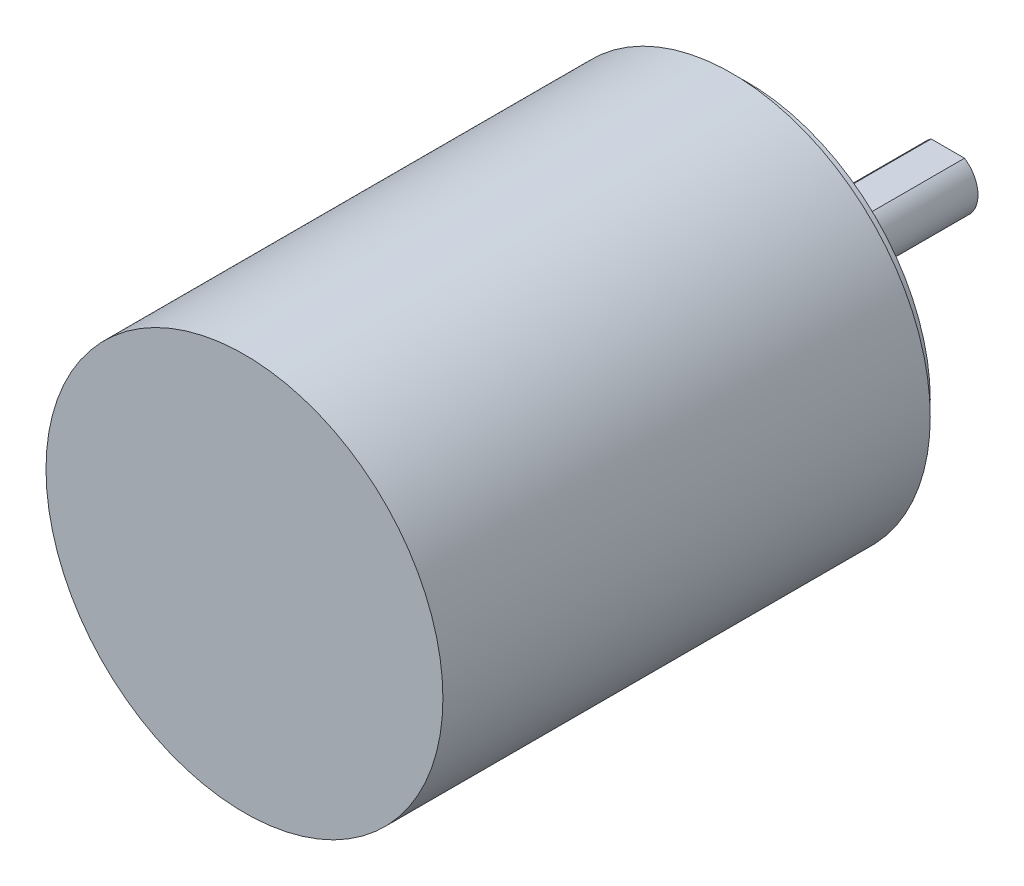
ISO-10303-21;
HEADER;
FILE_DESCRIPTION(('STEP AP214'),'2;1');
FILE_NAME('part.step','',(''),(''),'','','');
FILE_SCHEMA(('AUTOMOTIVE_DESIGN { 1 0 10303 214 1 1 1 1 }'));
ENDSEC;
DATA;
#1=APPLICATION_CONTEXT('core data for automotive mechanical design processes');
#2=APPLICATION_PROTOCOL_DEFINITION('international standard','automotive_design',2000,#1);
#3=PRODUCT_CONTEXT('',#1,'mechanical');
#4=PRODUCT('Part','Part','',(#3));
#5=PRODUCT_RELATED_PRODUCT_CATEGORY('part','',(#4));
#6=PRODUCT_DEFINITION_FORMATION('','',#4);
#7=PRODUCT_DEFINITION_CONTEXT('part definition',#1,'design');
#8=PRODUCT_DEFINITION('design','',#6,#7);
#9=PRODUCT_DEFINITION_SHAPE('','',#8);
#10=(LENGTH_UNIT() NAMED_UNIT(*) SI_UNIT(.MILLI.,.METRE.));
#11=(NAMED_UNIT(*) PLANE_ANGLE_UNIT() SI_UNIT($,.RADIAN.));
#12=(NAMED_UNIT(*) SI_UNIT($,.STERADIAN.) SOLID_ANGLE_UNIT());
#13=UNCERTAINTY_MEASURE_WITH_UNIT(LENGTH_MEASURE(1.E-05),#10,'distance_accuracy_value','');
#14=(GEOMETRIC_REPRESENTATION_CONTEXT(3) GLOBAL_UNCERTAINTY_ASSIGNED_CONTEXT((#13)) GLOBAL_UNIT_ASSIGNED_CONTEXT((#10,
#11,#12)) REPRESENTATION_CONTEXT('',''));
#15=CARTESIAN_POINT('',(0.,0.,0.));
#16=DIRECTION('',(0.,0.,1.));
#17=DIRECTION('',(1.,0.,0.));
#18=AXIS2_PLACEMENT_3D('',#15,#16,#17);
#19=CARTESIAN_POINT('',(0.,0.,-40.));
#20=DIRECTION('',(0.,0.,1.));
#21=DIRECTION('',(1.,0.,0.));
#22=AXIS2_PLACEMENT_3D('',#19,#20,#21);
#23=PLANE('',#22);
#24=CARTESIAN_POINT('',(0.,0.,-40.));
#25=DIRECTION('',(0.,0.,1.));
#26=DIRECTION('',(1.,0.,0.));
#27=AXIS2_PLACEMENT_3D('',#24,#25,#26);
#28=CIRCLE('',#27,6.);
#29=CARTESIAN_POINT('',(-3.3166247903554,5.,-40.));
#30=VERTEX_POINT('',#29);
#31=CARTESIAN_POINT('',(3.3166247903554,5.,-40.));
#32=VERTEX_POINT('',#31);
#33=EDGE_CURVE('E69',#30,#32,#28,.T.);
#34=ORIENTED_EDGE('',*,*,#33,.F.);
#35=DIRECTION('',(1.,0.,0.));
#36=VECTOR('',#35,1.);
#37=CARTESIAN_POINT('',(-8.,5.,-40.));
#38=LINE('',#37,#36);
#39=EDGE_CURVE('E72',#30,#32,#38,.T.);
#40=ORIENTED_EDGE('',*,*,#39,.T.);
#41=EDGE_LOOP('',(#34,#40));
#42=FACE_BOUND('',#41,.T.);
#43=ADVANCED_FACE('F41',(#42),#23,.F.);
#44=CARTESIAN_POINT('',(0.,0.,105.));
#45=DIRECTION('',(0.,0.,1.));
#46=DIRECTION('',(1.,0.,0.));
#47=AXIS2_PLACEMENT_3D('',#44,#45,#46);
#48=CYLINDRICAL_SURFACE('',#47,6.);
#49=ORIENTED_EDGE('',*,*,#33,.T.);
#50=DIRECTION('',(0.,0.,1.));
#51=VECTOR('',#50,1.);
#52=CARTESIAN_POINT('',(3.3166247903554,5.,105.));
#53=LINE('',#52,#51);
#54=CARTESIAN_POINT('',(3.3166247903554,5.,-11.));
#55=VERTEX_POINT('',#54);
#56=EDGE_CURVE('E11',#32,#55,#53,.T.);
#57=ORIENTED_EDGE('',*,*,#56,.T.);
#58=CARTESIAN_POINT('',(0.,0.,-11.));
#59=DIRECTION('',(0.,0.,-1.));
#60=DIRECTION('',(-1.,0.,0.));
#61=AXIS2_PLACEMENT_3D('',#58,#59,#60);
#62=CIRCLE('',#61,6.);
#63=CARTESIAN_POINT('',(-3.3166247903554,5.,-11.));
#64=VERTEX_POINT('',#63);
#65=EDGE_CURVE('E65',#64,#55,#62,.T.);
#66=ORIENTED_EDGE('',*,*,#65,.F.);
#67=DIRECTION('',(0.,0.,1.));
#68=VECTOR('',#67,1.);
#69=CARTESIAN_POINT('',(-3.3166247903554,5.,105.));
#70=LINE('',#69,#68);
#71=EDGE_CURVE('E48',#64,#30,#70,.F.);
#72=ORIENTED_EDGE('',*,*,#71,.T.);
#73=EDGE_LOOP('',(#49,#57,#66,#72));
#74=FACE_BOUND('',#73,.T.);
#75=CARTESIAN_POINT('',(0.,0.,0.));
#76=DIRECTION('',(0.,0.,1.));
#77=DIRECTION('',(1.,0.,0.));
#78=AXIS2_PLACEMENT_3D('',#75,#76,#77);
#79=CIRCLE('',#78,6.);
#80=CARTESIAN_POINT('',(6.,0.,0.));
#81=VERTEX_POINT('',#80);
#82=EDGE_CURVE('E79',#81,#81,#79,.T.);
#83=ORIENTED_EDGE('',*,*,#82,.F.);
#84=EDGE_LOOP('',(#83));
#85=FACE_BOUND('',#84,.T.);
#86=ADVANCED_FACE('F75',(#74,#85),#48,.T.);
#87=CARTESIAN_POINT('',(0.,6.,0.));
#88=DIRECTION('',(0.,0.,1.));
#89=DIRECTION('',(1.,0.,0.));
#90=AXIS2_PLACEMENT_3D('',#87,#88,#89);
#91=PLANE('',#90);
#92=CARTESIAN_POINT('',(0.,0.,0.));
#93=DIRECTION('',(0.,0.,1.));
#94=DIRECTION('',(1.,0.,0.));
#95=AXIS2_PLACEMENT_3D('',#92,#93,#94);
#96=CIRCLE('',#95,36.5);
#97=CARTESIAN_POINT('',(36.5,0.,0.));
#98=VERTEX_POINT('',#97);
#99=EDGE_CURVE('E82',#98,#98,#96,.T.);
#100=ORIENTED_EDGE('',*,*,#99,.F.);
#101=EDGE_LOOP('',(#100));
#102=FACE_BOUND('',#101,.T.);
#103=ORIENTED_EDGE('',*,*,#82,.T.);
#104=EDGE_LOOP('',(#103));
#105=FACE_BOUND('',#104,.T.);
#106=ADVANCED_FACE('F100',(#102,#105),#91,.F.);
#107=CARTESIAN_POINT('',(0.,0.,105.));
#108=DIRECTION('',(0.,0.,1.));
#109=DIRECTION('',(1.,0.,0.));
#110=AXIS2_PLACEMENT_3D('',#107,#108,#109);
#111=CYLINDRICAL_SURFACE('',#110,36.5);
#112=CARTESIAN_POINT('',(0.,0.,3.));
#113=DIRECTION('',(0.,0.,1.));
#114=DIRECTION('',(1.,0.,0.));
#115=AXIS2_PLACEMENT_3D('',#112,#113,#114);
#116=CIRCLE('',#115,36.5);
#117=CARTESIAN_POINT('',(36.5,0.,3.));
#118=VERTEX_POINT('',#117);
#119=EDGE_CURVE('E87',#118,#118,#116,.T.);
#120=ORIENTED_EDGE('',*,*,#119,.F.);
#121=EDGE_LOOP('',(#120));
#122=FACE_BOUND('',#121,.T.);
#123=ORIENTED_EDGE('',*,*,#99,.T.);
#124=EDGE_LOOP('',(#123));
#125=FACE_BOUND('',#124,.T.);
#126=ADVANCED_FACE('F104',(#122,#125),#111,.T.);
#127=CARTESIAN_POINT('',(0.,36.5,3.));
#128=DIRECTION('',(0.,0.,1.));
#129=DIRECTION('',(1.,0.,0.));
#130=AXIS2_PLACEMENT_3D('',#127,#128,#129);
#131=PLANE('',#130);
#132=CARTESIAN_POINT('',(0.,0.,3.));
#133=DIRECTION('',(0.,0.,1.));
#134=DIRECTION('',(1.,0.,0.));
#135=AXIS2_PLACEMENT_3D('',#132,#133,#134);
#136=CIRCLE('',#135,39.5);
#137=CARTESIAN_POINT('',(39.5,0.,3.));
#138=VERTEX_POINT('',#137);
#139=EDGE_CURVE('E90',#138,#138,#136,.T.);
#140=ORIENTED_EDGE('',*,*,#139,.F.);
#141=EDGE_LOOP('',(#140));
#142=FACE_BOUND('',#141,.T.);
#143=ORIENTED_EDGE('',*,*,#119,.T.);
#144=EDGE_LOOP('',(#143));
#145=FACE_BOUND('',#144,.T.);
#146=ADVANCED_FACE('F110',(#142,#145),#131,.F.);
#147=CARTESIAN_POINT('',(0.,0.,105.));
#148=DIRECTION('',(0.,0.,1.));
#149=DIRECTION('',(1.,0.,0.));
#150=AXIS2_PLACEMENT_3D('',#147,#148,#149);
#151=CYLINDRICAL_SURFACE('',#150,39.5);
#152=CARTESIAN_POINT('',(0.,0.,100.));
#153=DIRECTION('',(0.,0.,1.));
#154=DIRECTION('',(1.,0.,0.));
#155=AXIS2_PLACEMENT_3D('',#152,#153,#154);
#156=CIRCLE('',#155,39.5);
#157=CARTESIAN_POINT('',(39.5,0.,100.));
#158=VERTEX_POINT('',#157);
#159=EDGE_CURVE('E93',#158,#158,#156,.T.);
#160=ORIENTED_EDGE('',*,*,#159,.F.);
#161=EDGE_LOOP('',(#160));
#162=FACE_BOUND('',#161,.T.);
#163=ORIENTED_EDGE('',*,*,#139,.T.);
#164=EDGE_LOOP('',(#163));
#165=FACE_BOUND('',#164,.T.);
#166=ADVANCED_FACE('F114',(#162,#165),#151,.T.);
#167=CARTESIAN_POINT('',(0.,39.5,100.));
#168=DIRECTION('',(0.,0.,-1.));
#169=DIRECTION('',(-1.,0.,0.));
#170=AXIS2_PLACEMENT_3D('',#167,#168,#169);
#171=PLANE('',#170);
#172=ORIENTED_EDGE('',*,*,#159,.T.);
#173=EDGE_LOOP('',(#172));
#174=FACE_BOUND('',#173,.T.);
#175=ADVANCED_FACE('F118',(#174),#171,.F.);
#176=CARTESIAN_POINT('',(-8.,5.,-40.));
#177=DIRECTION('',(0.,-1.,0.));
#178=DIRECTION('',(0.,0.,-1.));
#179=AXIS2_PLACEMENT_3D('',#176,#177,#178);
#180=PLANE('',#179);
#181=ORIENTED_EDGE('',*,*,#39,.F.);
#182=ORIENTED_EDGE('',*,*,#71,.F.);
#183=DIRECTION('',(1.,0.,0.));
#184=VECTOR('',#183,1.);
#185=CARTESIAN_POINT('',(-8.,5.,-11.));
#186=LINE('',#185,#184);
#187=EDGE_CURVE('E54',#64,#55,#186,.T.);
#188=ORIENTED_EDGE('',*,*,#187,.T.);
#189=ORIENTED_EDGE('',*,*,#56,.F.);
#190=EDGE_LOOP('',(#181,#182,#188,#189));
#191=FACE_BOUND('',#190,.T.);
#192=ADVANCED_FACE('F71',(#191),#180,.F.);
#193=CARTESIAN_POINT('',(0.,0.,-11.));
#194=DIRECTION('',(0.,0.,-1.));
#195=DIRECTION('',(-1.,0.,0.));
#196=AXIS2_PLACEMENT_3D('',#193,#194,#195);
#197=PLANE('',#196);
#198=ORIENTED_EDGE('',*,*,#65,.T.);
#199=ORIENTED_EDGE('',*,*,#187,.F.);
#200=EDGE_LOOP('',(#198,#199));
#201=FACE_BOUND('',#200,.T.);
#202=ADVANCED_FACE('F66',(#201),#197,.T.);
#203=CLOSED_SHELL('',(#43,#86,#106,#126,#146,#166,#175,#192,#202));
#204=MANIFOLD_SOLID_BREP('B2',#203);
#205=ADVANCED_BREP_SHAPE_REPRESENTATION('',(#18,#204),#14);
#206=SHAPE_DEFINITION_REPRESENTATION(#9,#205);
ENDSEC;
END-ISO-10303-21;
